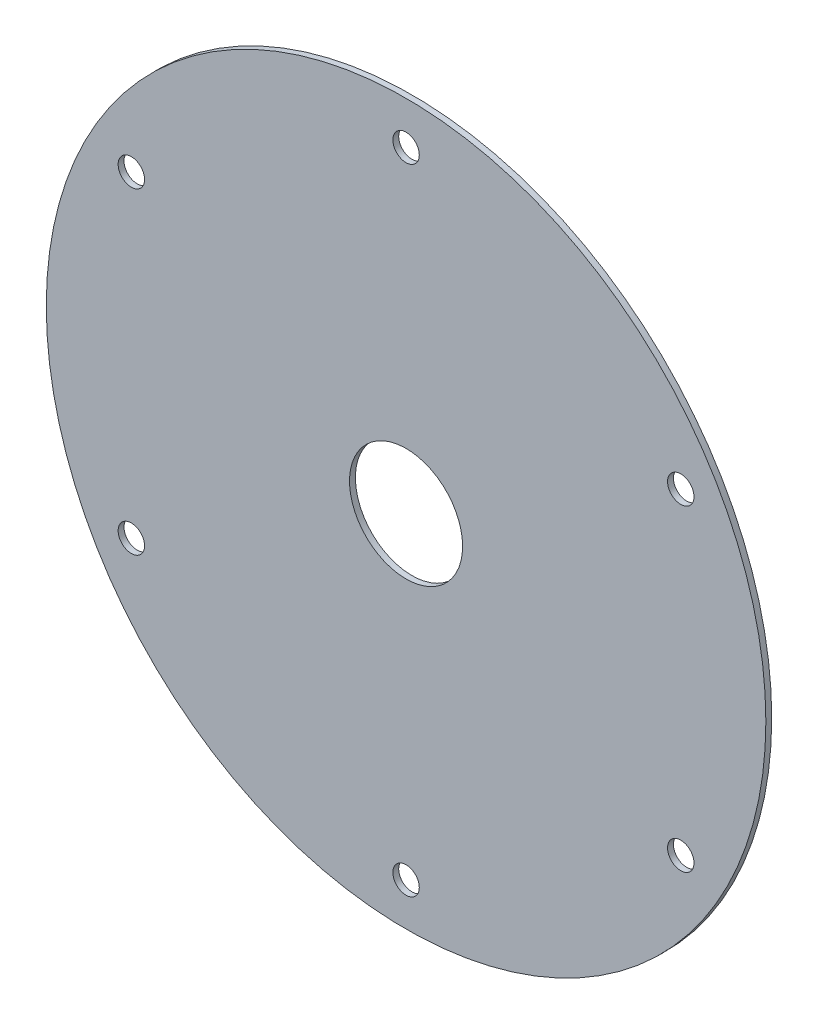
ISO-10303-21;
HEADER;
FILE_DESCRIPTION(('STEP AP214'),'2;1');
FILE_NAME('part.step','',(''),(''),'','','');
FILE_SCHEMA(('AUTOMOTIVE_DESIGN { 1 0 10303 214 1 1 1 1 }'));
ENDSEC;
DATA;
#1=APPLICATION_CONTEXT('core data for automotive mechanical design processes');
#2=APPLICATION_PROTOCOL_DEFINITION('international standard','automotive_design',2000,#1);
#3=PRODUCT_CONTEXT('',#1,'mechanical');
#4=PRODUCT('Part','Part','',(#3));
#5=PRODUCT_RELATED_PRODUCT_CATEGORY('part','',(#4));
#6=PRODUCT_DEFINITION_FORMATION('','',#4);
#7=PRODUCT_DEFINITION_CONTEXT('part definition',#1,'design');
#8=PRODUCT_DEFINITION('design','',#6,#7);
#9=PRODUCT_DEFINITION_SHAPE('','',#8);
#10=(LENGTH_UNIT() NAMED_UNIT(*) SI_UNIT(.MILLI.,.METRE.));
#11=(NAMED_UNIT(*) PLANE_ANGLE_UNIT() SI_UNIT($,.RADIAN.));
#12=(NAMED_UNIT(*) SI_UNIT($,.STERADIAN.) SOLID_ANGLE_UNIT());
#13=UNCERTAINTY_MEASURE_WITH_UNIT(LENGTH_MEASURE(1.E-05),#10,'distance_accuracy_value','');
#14=(GEOMETRIC_REPRESENTATION_CONTEXT(3) GLOBAL_UNCERTAINTY_ASSIGNED_CONTEXT((#13)) GLOBAL_UNIT_ASSIGNED_CONTEXT((#10,
#11,#12)) REPRESENTATION_CONTEXT('',''));
#15=CARTESIAN_POINT('',(0.,0.,0.));
#16=DIRECTION('',(0.,0.,1.));
#17=DIRECTION('',(1.,0.,0.));
#18=AXIS2_PLACEMENT_3D('',#15,#16,#17);
#19=CARTESIAN_POINT('',(0.,0.,4.));
#20=DIRECTION('',(0.,0.,1.));
#21=DIRECTION('',(1.,0.,0.));
#22=AXIS2_PLACEMENT_3D('',#19,#20,#21);
#23=PLANE('',#22);
#24=CARTESIAN_POINT('',(-187.061487217439,-108.,4.));
#25=DIRECTION('',(0.,0.,1.));
#26=DIRECTION('',(1.,0.,0.));
#27=AXIS2_PLACEMENT_3D('',#24,#25,#26);
#28=CIRCLE('',#27,9.00000000000001);
#29=CARTESIAN_POINT('',(-178.061487217439,-108.,4.));
#30=VERTEX_POINT('',#29);
#31=EDGE_CURVE('E99',#30,#30,#28,.T.);
#32=ORIENTED_EDGE('',*,*,#31,.F.);
#33=EDGE_LOOP('',(#32));
#34=FACE_BOUND('',#33,.T.);
#35=CARTESIAN_POINT('',(187.061487217439,-108.,4.));
#36=DIRECTION('',(0.,0.,1.));
#37=DIRECTION('',(1.,0.,0.));
#38=AXIS2_PLACEMENT_3D('',#35,#36,#37);
#39=CIRCLE('',#38,9.00000000000001);
#40=CARTESIAN_POINT('',(196.061487217439,-108.,4.));
#41=VERTEX_POINT('',#40);
#42=EDGE_CURVE('E83',#41,#41,#39,.T.);
#43=ORIENTED_EDGE('',*,*,#42,.F.);
#44=EDGE_LOOP('',(#43));
#45=FACE_BOUND('',#44,.T.);
#46=CARTESIAN_POINT('',(0.,216.,4.));
#47=DIRECTION('',(0.,0.,1.));
#48=DIRECTION('',(1.,0.,0.));
#49=AXIS2_PLACEMENT_3D('',#46,#47,#48);
#50=CIRCLE('',#49,9.);
#51=CARTESIAN_POINT('',(9.,216.,4.));
#52=VERTEX_POINT('',#51);
#53=EDGE_CURVE('E67',#52,#52,#50,.T.);
#54=ORIENTED_EDGE('',*,*,#53,.F.);
#55=EDGE_LOOP('',(#54));
#56=FACE_BOUND('',#55,.T.);
#57=CARTESIAN_POINT('',(0.,0.,4.));
#58=DIRECTION('',(0.,0.,1.));
#59=DIRECTION('',(1.,0.,0.));
#60=AXIS2_PLACEMENT_3D('',#57,#58,#59);
#61=CIRCLE('',#60,245.);
#62=CARTESIAN_POINT('',(245.,0.,4.));
#63=VERTEX_POINT('',#62);
#64=EDGE_CURVE('E10',#63,#63,#61,.T.);
#65=ORIENTED_EDGE('',*,*,#64,.T.);
#66=EDGE_LOOP('',(#65));
#67=FACE_BOUND('',#66,.T.);
#68=CARTESIAN_POINT('',(0.,0.,4.));
#69=DIRECTION('',(0.,0.,1.));
#70=DIRECTION('',(1.,0.,0.));
#71=AXIS2_PLACEMENT_3D('',#68,#69,#70);
#72=CIRCLE('',#71,38.5);
#73=CARTESIAN_POINT('',(38.5,0.,4.));
#74=VERTEX_POINT('',#73);
#75=EDGE_CURVE('E61',#74,#74,#72,.T.);
#76=ORIENTED_EDGE('',*,*,#75,.F.);
#77=EDGE_LOOP('',(#76));
#78=FACE_BOUND('',#77,.T.);
#79=CARTESIAN_POINT('',(187.061487217439,108.,4.));
#80=DIRECTION('',(0.,0.,1.));
#81=DIRECTION('',(1.,0.,0.));
#82=AXIS2_PLACEMENT_3D('',#79,#80,#81);
#83=CIRCLE('',#82,8.99999999999998);
#84=CARTESIAN_POINT('',(196.061487217439,108.,4.));
#85=VERTEX_POINT('',#84);
#86=EDGE_CURVE('E75',#85,#85,#83,.T.);
#87=ORIENTED_EDGE('',*,*,#86,.F.);
#88=EDGE_LOOP('',(#87));
#89=FACE_BOUND('',#88,.T.);
#90=CARTESIAN_POINT('',(0.,-216.,4.));
#91=DIRECTION('',(0.,0.,1.));
#92=DIRECTION('',(1.,0.,0.));
#93=AXIS2_PLACEMENT_3D('',#90,#91,#92);
#94=CIRCLE('',#93,9.);
#95=CARTESIAN_POINT('',(9.00000000000002,-216.,4.));
#96=VERTEX_POINT('',#95);
#97=EDGE_CURVE('E91',#96,#96,#94,.T.);
#98=ORIENTED_EDGE('',*,*,#97,.F.);
#99=EDGE_LOOP('',(#98));
#100=FACE_BOUND('',#99,.T.);
#101=CARTESIAN_POINT('',(-187.061487217439,108.,4.));
#102=DIRECTION('',(0.,0.,1.));
#103=DIRECTION('',(1.,0.,0.));
#104=AXIS2_PLACEMENT_3D('',#101,#102,#103);
#105=CIRCLE('',#104,8.99999999999998);
#106=CARTESIAN_POINT('',(-178.061487217439,108.,4.));
#107=VERTEX_POINT('',#106);
#108=EDGE_CURVE('E107',#107,#107,#105,.T.);
#109=ORIENTED_EDGE('',*,*,#108,.F.);
#110=EDGE_LOOP('',(#109));
#111=FACE_BOUND('',#110,.T.);
#112=ADVANCED_FACE('F47',(#34,#45,#56,#67,#78,#89,#100,#111),#23,.T.);
#113=CARTESIAN_POINT('',(0.,0.,0.));
#114=DIRECTION('',(0.,0.,1.));
#115=DIRECTION('',(1.,0.,0.));
#116=AXIS2_PLACEMENT_3D('',#113,#114,#115);
#117=PLANE('',#116);
#118=CARTESIAN_POINT('',(0.,0.,0.));
#119=DIRECTION('',(0.,0.,1.));
#120=DIRECTION('',(1.,0.,0.));
#121=AXIS2_PLACEMENT_3D('',#118,#119,#120);
#122=CIRCLE('',#121,245.);
#123=CARTESIAN_POINT('',(245.,0.,0.));
#124=VERTEX_POINT('',#123);
#125=EDGE_CURVE('E51',#124,#124,#122,.T.);
#126=ORIENTED_EDGE('',*,*,#125,.F.);
#127=EDGE_LOOP('',(#126));
#128=FACE_BOUND('',#127,.T.);
#129=CARTESIAN_POINT('',(0.,0.,0.));
#130=DIRECTION('',(0.,0.,1.));
#131=DIRECTION('',(1.,0.,0.));
#132=AXIS2_PLACEMENT_3D('',#129,#130,#131);
#133=CIRCLE('',#132,38.5);
#134=CARTESIAN_POINT('',(38.5,0.,0.));
#135=VERTEX_POINT('',#134);
#136=EDGE_CURVE('E63',#135,#135,#133,.T.);
#137=ORIENTED_EDGE('',*,*,#136,.T.);
#138=EDGE_LOOP('',(#137));
#139=FACE_BOUND('',#138,.T.);
#140=CARTESIAN_POINT('',(0.,216.,0.));
#141=DIRECTION('',(0.,0.,1.));
#142=DIRECTION('',(1.,0.,0.));
#143=AXIS2_PLACEMENT_3D('',#140,#141,#142);
#144=CIRCLE('',#143,9.);
#145=CARTESIAN_POINT('',(9.,216.,0.));
#146=VERTEX_POINT('',#145);
#147=EDGE_CURVE('E71',#146,#146,#144,.T.);
#148=ORIENTED_EDGE('',*,*,#147,.T.);
#149=EDGE_LOOP('',(#148));
#150=FACE_BOUND('',#149,.T.);
#151=CARTESIAN_POINT('',(187.061487217439,108.,0.));
#152=DIRECTION('',(0.,0.,1.));
#153=DIRECTION('',(1.,0.,0.));
#154=AXIS2_PLACEMENT_3D('',#151,#152,#153);
#155=CIRCLE('',#154,8.99999999999998);
#156=CARTESIAN_POINT('',(196.061487217439,108.,0.));
#157=VERTEX_POINT('',#156);
#158=EDGE_CURVE('E79',#157,#157,#155,.T.);
#159=ORIENTED_EDGE('',*,*,#158,.T.);
#160=EDGE_LOOP('',(#159));
#161=FACE_BOUND('',#160,.T.);
#162=CARTESIAN_POINT('',(187.061487217439,-108.,0.));
#163=DIRECTION('',(0.,0.,1.));
#164=DIRECTION('',(1.,0.,0.));
#165=AXIS2_PLACEMENT_3D('',#162,#163,#164);
#166=CIRCLE('',#165,9.00000000000001);
#167=CARTESIAN_POINT('',(196.061487217439,-108.,0.));
#168=VERTEX_POINT('',#167);
#169=EDGE_CURVE('E87',#168,#168,#166,.T.);
#170=ORIENTED_EDGE('',*,*,#169,.T.);
#171=EDGE_LOOP('',(#170));
#172=FACE_BOUND('',#171,.T.);
#173=CARTESIAN_POINT('',(0.,-216.,0.));
#174=DIRECTION('',(0.,0.,1.));
#175=DIRECTION('',(1.,0.,0.));
#176=AXIS2_PLACEMENT_3D('',#173,#174,#175);
#177=CIRCLE('',#176,9.);
#178=CARTESIAN_POINT('',(9.00000000000002,-216.,0.));
#179=VERTEX_POINT('',#178);
#180=EDGE_CURVE('E95',#179,#179,#177,.T.);
#181=ORIENTED_EDGE('',*,*,#180,.T.);
#182=EDGE_LOOP('',(#181));
#183=FACE_BOUND('',#182,.T.);
#184=CARTESIAN_POINT('',(-187.061487217439,-108.,0.));
#185=DIRECTION('',(0.,0.,1.));
#186=DIRECTION('',(1.,0.,0.));
#187=AXIS2_PLACEMENT_3D('',#184,#185,#186);
#188=CIRCLE('',#187,9.00000000000001);
#189=CARTESIAN_POINT('',(-178.061487217439,-108.,0.));
#190=VERTEX_POINT('',#189);
#191=EDGE_CURVE('E103',#190,#190,#188,.T.);
#192=ORIENTED_EDGE('',*,*,#191,.T.);
#193=EDGE_LOOP('',(#192));
#194=FACE_BOUND('',#193,.T.);
#195=CARTESIAN_POINT('',(-187.061487217439,108.,0.));
#196=DIRECTION('',(0.,0.,1.));
#197=DIRECTION('',(1.,0.,0.));
#198=AXIS2_PLACEMENT_3D('',#195,#196,#197);
#199=CIRCLE('',#198,8.99999999999998);
#200=CARTESIAN_POINT('',(-178.061487217439,108.,0.));
#201=VERTEX_POINT('',#200);
#202=EDGE_CURVE('E111',#201,#201,#199,.T.);
#203=ORIENTED_EDGE('',*,*,#202,.T.);
#204=EDGE_LOOP('',(#203));
#205=FACE_BOUND('',#204,.T.);
#206=ADVANCED_FACE('F124',(#128,#139,#150,#161,#172,#183,#194,#205),#117,.F.);
#207=CARTESIAN_POINT('',(0.,0.,4.));
#208=DIRECTION('',(0.,0.,-1.));
#209=DIRECTION('',(-1.,0.,0.));
#210=AXIS2_PLACEMENT_3D('',#207,#208,#209);
#211=CYLINDRICAL_SURFACE('',#210,245.);
#212=ORIENTED_EDGE('',*,*,#64,.F.);
#213=EDGE_LOOP('',(#212));
#214=FACE_BOUND('',#213,.T.);
#215=ORIENTED_EDGE('',*,*,#125,.T.);
#216=EDGE_LOOP('',(#215));
#217=FACE_BOUND('',#216,.T.);
#218=ADVANCED_FACE('F49',(#214,#217),#211,.T.);
#219=CARTESIAN_POINT('',(0.,0.,4.));
#220=DIRECTION('',(0.,0.,-1.));
#221=DIRECTION('',(-1.,0.,0.));
#222=AXIS2_PLACEMENT_3D('',#219,#220,#221);
#223=CYLINDRICAL_SURFACE('',#222,38.5);
#224=ORIENTED_EDGE('',*,*,#75,.T.);
#225=EDGE_LOOP('',(#224));
#226=FACE_BOUND('',#225,.T.);
#227=ORIENTED_EDGE('',*,*,#136,.F.);
#228=EDGE_LOOP('',(#227));
#229=FACE_BOUND('',#228,.T.);
#230=ADVANCED_FACE('F134',(#226,#229),#223,.F.);
#231=CARTESIAN_POINT('',(0.,216.,4.));
#232=DIRECTION('',(0.,0.,-1.));
#233=DIRECTION('',(-1.,0.,0.));
#234=AXIS2_PLACEMENT_3D('',#231,#232,#233);
#235=CYLINDRICAL_SURFACE('',#234,9.);
#236=ORIENTED_EDGE('',*,*,#53,.T.);
#237=EDGE_LOOP('',(#236));
#238=FACE_BOUND('',#237,.T.);
#239=ORIENTED_EDGE('',*,*,#147,.F.);
#240=EDGE_LOOP('',(#239));
#241=FACE_BOUND('',#240,.T.);
#242=ADVANCED_FACE('F137',(#238,#241),#235,.F.);
#243=CARTESIAN_POINT('',(187.061487217439,108.,4.));
#244=DIRECTION('',(0.,0.,-1.));
#245=DIRECTION('',(-1.,0.,0.));
#246=AXIS2_PLACEMENT_3D('',#243,#244,#245);
#247=CYLINDRICAL_SURFACE('',#246,8.99999999999998);
#248=ORIENTED_EDGE('',*,*,#86,.T.);
#249=EDGE_LOOP('',(#248));
#250=FACE_BOUND('',#249,.T.);
#251=ORIENTED_EDGE('',*,*,#158,.F.);
#252=EDGE_LOOP('',(#251));
#253=FACE_BOUND('',#252,.T.);
#254=ADVANCED_FACE('F141',(#250,#253),#247,.F.);
#255=CARTESIAN_POINT('',(187.061487217439,-108.,4.));
#256=DIRECTION('',(0.,0.,-1.));
#257=DIRECTION('',(-1.,0.,0.));
#258=AXIS2_PLACEMENT_3D('',#255,#256,#257);
#259=CYLINDRICAL_SURFACE('',#258,9.00000000000001);
#260=ORIENTED_EDGE('',*,*,#42,.T.);
#261=EDGE_LOOP('',(#260));
#262=FACE_BOUND('',#261,.T.);
#263=ORIENTED_EDGE('',*,*,#169,.F.);
#264=EDGE_LOOP('',(#263));
#265=FACE_BOUND('',#264,.T.);
#266=ADVANCED_FACE('F145',(#262,#265),#259,.F.);
#267=CARTESIAN_POINT('',(0.,-216.,4.));
#268=DIRECTION('',(0.,0.,-1.));
#269=DIRECTION('',(-1.,0.,0.));
#270=AXIS2_PLACEMENT_3D('',#267,#268,#269);
#271=CYLINDRICAL_SURFACE('',#270,9.);
#272=ORIENTED_EDGE('',*,*,#97,.T.);
#273=EDGE_LOOP('',(#272));
#274=FACE_BOUND('',#273,.T.);
#275=ORIENTED_EDGE('',*,*,#180,.F.);
#276=EDGE_LOOP('',(#275));
#277=FACE_BOUND('',#276,.T.);
#278=ADVANCED_FACE('F149',(#274,#277),#271,.F.);
#279=CARTESIAN_POINT('',(-187.061487217439,-108.,4.));
#280=DIRECTION('',(0.,0.,-1.));
#281=DIRECTION('',(-1.,0.,0.));
#282=AXIS2_PLACEMENT_3D('',#279,#280,#281);
#283=CYLINDRICAL_SURFACE('',#282,9.00000000000001);
#284=ORIENTED_EDGE('',*,*,#31,.T.);
#285=EDGE_LOOP('',(#284));
#286=FACE_BOUND('',#285,.T.);
#287=ORIENTED_EDGE('',*,*,#191,.F.);
#288=EDGE_LOOP('',(#287));
#289=FACE_BOUND('',#288,.T.);
#290=ADVANCED_FACE('F153',(#286,#289),#283,.F.);
#291=CARTESIAN_POINT('',(-187.061487217439,108.,4.));
#292=DIRECTION('',(0.,0.,-1.));
#293=DIRECTION('',(-1.,0.,0.));
#294=AXIS2_PLACEMENT_3D('',#291,#292,#293);
#295=CYLINDRICAL_SURFACE('',#294,8.99999999999998);
#296=ORIENTED_EDGE('',*,*,#108,.T.);
#297=EDGE_LOOP('',(#296));
#298=FACE_BOUND('',#297,.T.);
#299=ORIENTED_EDGE('',*,*,#202,.F.);
#300=EDGE_LOOP('',(#299));
#301=FACE_BOUND('',#300,.T.);
#302=ADVANCED_FACE('F120',(#298,#301),#295,.F.);
#303=CLOSED_SHELL('',(#112,#206,#218,#230,#242,#254,#266,#278,#290,#302));
#304=MANIFOLD_SOLID_BREP('B2',#303);
#305=ADVANCED_BREP_SHAPE_REPRESENTATION('',(#18,#304),#14);
#306=SHAPE_DEFINITION_REPRESENTATION(#9,#305);
ENDSEC;
END-ISO-10303-21;
